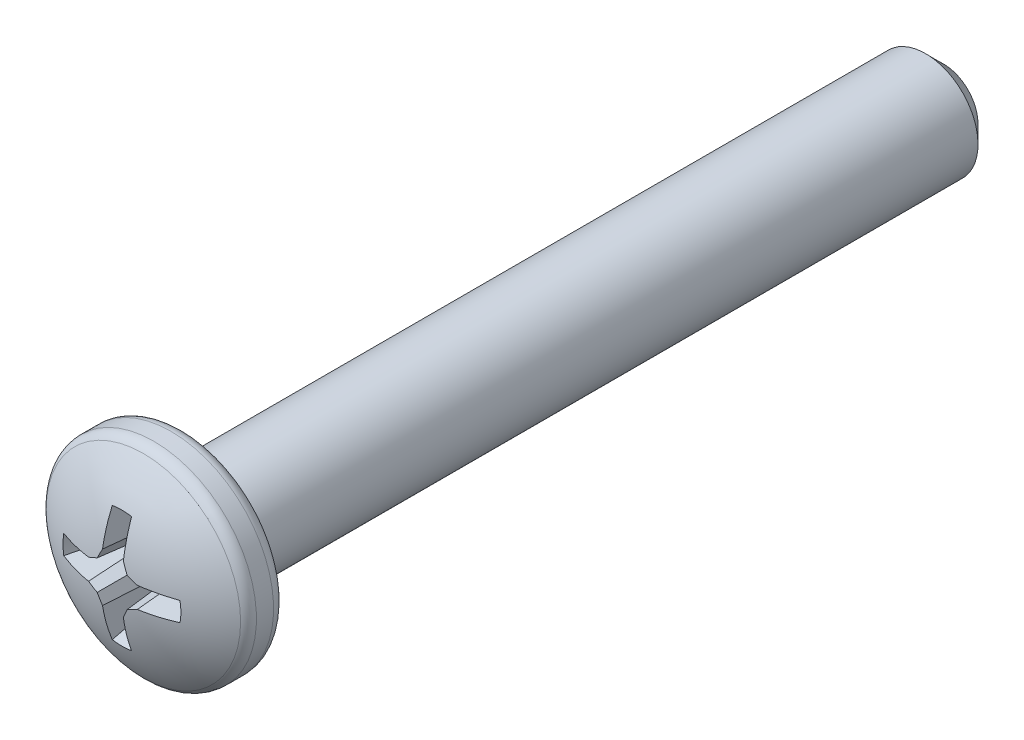
ISO-10303-21;
HEADER;
FILE_DESCRIPTION(('STEP AP214'),'2;1');
FILE_NAME('part.step','',(''),(''),'','','');
FILE_SCHEMA(('AUTOMOTIVE_DESIGN { 1 0 10303 214 1 1 1 1 }'));
ENDSEC;
DATA;
#1=APPLICATION_CONTEXT('core data for automotive mechanical design processes');
#2=APPLICATION_PROTOCOL_DEFINITION('international standard','automotive_design',2000,#1);
#3=PRODUCT_CONTEXT('',#1,'mechanical');
#4=PRODUCT('Part','Part','',(#3));
#5=PRODUCT_RELATED_PRODUCT_CATEGORY('part','',(#4));
#6=PRODUCT_DEFINITION_FORMATION('','',#4);
#7=PRODUCT_DEFINITION_CONTEXT('part definition',#1,'design');
#8=PRODUCT_DEFINITION('design','',#6,#7);
#9=PRODUCT_DEFINITION_SHAPE('','',#8);
#10=(LENGTH_UNIT() NAMED_UNIT(*) SI_UNIT(.MILLI.,.METRE.));
#11=(NAMED_UNIT(*) PLANE_ANGLE_UNIT() SI_UNIT($,.RADIAN.));
#12=(NAMED_UNIT(*) SI_UNIT($,.STERADIAN.) SOLID_ANGLE_UNIT());
#13=UNCERTAINTY_MEASURE_WITH_UNIT(LENGTH_MEASURE(1.E-05),#10,'distance_accuracy_value','');
#14=(GEOMETRIC_REPRESENTATION_CONTEXT(3) GLOBAL_UNCERTAINTY_ASSIGNED_CONTEXT((#13)) GLOBAL_UNIT_ASSIGNED_CONTEXT((#10,
#11,#12)) REPRESENTATION_CONTEXT('',''));
#15=CARTESIAN_POINT('',(0.,0.,0.));
#16=DIRECTION('',(0.,0.,1.));
#17=DIRECTION('',(1.,0.,0.));
#18=AXIS2_PLACEMENT_3D('',#15,#16,#17);
#19=CARTESIAN_POINT('',(0.,1.75259999999998,0.));
#20=DIRECTION('',(0.,0.,1.));
#21=DIRECTION('',(0.,-1.,0.));
#22=AXIS2_PLACEMENT_3D('',#19,#20,#21);
#23=PLANE('',#22);
#24=CARTESIAN_POINT('',(0.,0.,0.));
#25=DIRECTION('',(0.,0.,1.));
#26=DIRECTION('',(0.,-1.,0.));
#27=AXIS2_PLACEMENT_3D('',#24,#25,#26);
#28=CIRCLE('',#27,1.75259999999998);
#29=CARTESIAN_POINT('',(0.,-1.75259999999998,0.));
#30=VERTEX_POINT('',#29);
#31=EDGE_CURVE('E418',#30,#30,#28,.T.);
#32=ORIENTED_EDGE('',*,*,#31,.T.);
#33=EDGE_LOOP('',(#32));
#34=FACE_BOUND('',#33,.T.);
#35=CARTESIAN_POINT('',(0.,0.,0.));
#36=DIRECTION('',(0.,0.,-1.));
#37=DIRECTION('',(0.,1.,0.));
#38=AXIS2_PLACEMENT_3D('',#35,#36,#37);
#39=CIRCLE('',#38,2.985516);
#40=CARTESIAN_POINT('',(0.,2.985516,0.));
#41=VERTEX_POINT('',#40);
#42=EDGE_CURVE('E414',#41,#41,#39,.T.);
#43=ORIENTED_EDGE('',*,*,#42,.T.);
#44=EDGE_LOOP('',(#43));
#45=FACE_BOUND('',#44,.T.);
#46=ADVANCED_FACE('F39',(#34,#45),#23,.F.);
#47=CARTESIAN_POINT('',(0.,0.,-25.4));
#48=DIRECTION('',(0.,0.,1.));
#49=DIRECTION('',(0.,-1.,0.));
#50=AXIS2_PLACEMENT_3D('',#47,#48,#49);
#51=PLANE('',#50);
#52=CARTESIAN_POINT('',(0.,0.,-25.4));
#53=DIRECTION('',(0.,0.,1.));
#54=DIRECTION('',(0.,-1.,0.));
#55=AXIS2_PLACEMENT_3D('',#52,#53,#54);
#56=CIRCLE('',#55,1.15728749999998);
#57=CARTESIAN_POINT('',(0.,-1.15728749999998,-25.4));
#58=VERTEX_POINT('',#57);
#59=EDGE_CURVE('E426',#58,#58,#56,.T.);
#60=ORIENTED_EDGE('',*,*,#59,.F.);
#61=EDGE_LOOP('',(#60));
#62=FACE_BOUND('',#61,.T.);
#63=ADVANCED_FACE('F484',(#62),#51,.F.);
#64=CARTESIAN_POINT('',(0.,0.,-25.4));
#65=DIRECTION('',(0.,0.,1.));
#66=DIRECTION('',(0.,-1.,0.));
#67=AXIS2_PLACEMENT_3D('',#64,#65,#66);
#68=CONICAL_SURFACE('',#67,1.15728749999998,0.785398163397442);
#69=CARTESIAN_POINT('',(0.,0.,-24.8046875));
#70=DIRECTION('',(0.,0.,1.));
#71=DIRECTION('',(0.,-1.,0.));
#72=AXIS2_PLACEMENT_3D('',#69,#70,#71);
#73=CIRCLE('',#72,1.75259999999998);
#74=CARTESIAN_POINT('',(0.,-1.75259999999998,-24.8046875));
#75=VERTEX_POINT('',#74);
#76=EDGE_CURVE('E422',#75,#75,#73,.T.);
#77=ORIENTED_EDGE('',*,*,#76,.F.);
#78=EDGE_LOOP('',(#77));
#79=FACE_BOUND('',#78,.T.);
#80=ORIENTED_EDGE('',*,*,#59,.T.);
#81=EDGE_LOOP('',(#80));
#82=FACE_BOUND('',#81,.T.);
#83=ADVANCED_FACE('F490',(#79,#82),#68,.T.);
#84=CARTESIAN_POINT('',(0.,0.,2.4638));
#85=DIRECTION('',(0.,0.,1.));
#86=DIRECTION('',(0.,-1.,0.));
#87=AXIS2_PLACEMENT_3D('',#84,#85,#86);
#88=CYLINDRICAL_SURFACE('',#87,1.75259999999998);
#89=ORIENTED_EDGE('',*,*,#31,.F.);
#90=EDGE_LOOP('',(#89));
#91=FACE_BOUND('',#90,.T.);
#92=ORIENTED_EDGE('',*,*,#76,.T.);
#93=EDGE_LOOP('',(#92));
#94=FACE_BOUND('',#93,.T.);
#95=ADVANCED_FACE('F498',(#91,#94),#88,.T.);
#96=CARTESIAN_POINT('',(0.,0.,0.443484));
#97=DIRECTION('',(0.,0.,-1.));
#98=DIRECTION('',(0.,1.,0.));
#99=AXIS2_PLACEMENT_3D('',#96,#97,#98);
#100=TOROIDAL_SURFACE('',#99,2.985516,0.443484);
#101=ORIENTED_EDGE('',*,*,#42,.F.);
#102=EDGE_LOOP('',(#101));
#103=FACE_BOUND('',#102,.T.);
#104=CARTESIAN_POINT('',(0.,0.,0.443484));
#105=DIRECTION('',(0.,0.,-1.));
#106=DIRECTION('',(0.,1.,0.));
#107=AXIS2_PLACEMENT_3D('',#104,#105,#106);
#108=CIRCLE('',#107,3.429);
#109=CARTESIAN_POINT('',(0.,3.429,0.443484000000001));
#110=VERTEX_POINT('',#109);
#111=EDGE_CURVE('E410',#110,#110,#108,.T.);
#112=ORIENTED_EDGE('',*,*,#111,.T.);
#113=EDGE_LOOP('',(#112));
#114=FACE_BOUND('',#113,.T.);
#115=ADVANCED_FACE('F501',(#103,#114),#100,.T.);
#116=CARTESIAN_POINT('',(0.,0.,2.4638));
#117=DIRECTION('',(0.,0.,1.));
#118=DIRECTION('',(0.,-1.,0.));
#119=AXIS2_PLACEMENT_3D('',#116,#117,#118);
#120=CYLINDRICAL_SURFACE('',#119,3.429);
#121=ORIENTED_EDGE('',*,*,#111,.F.);
#122=EDGE_LOOP('',(#121));
#123=FACE_BOUND('',#122,.T.);
#124=CARTESIAN_POINT('',(0.,0.,1.01730649953871));
#125=DIRECTION('',(0.,0.,-1.));
#126=DIRECTION('',(0.,1.,0.));
#127=AXIS2_PLACEMENT_3D('',#124,#125,#126);
#128=CIRCLE('',#127,3.429);
#129=CARTESIAN_POINT('',(0.,3.429,1.01730649953871));
#130=VERTEX_POINT('',#129);
#131=EDGE_CURVE('E406',#130,#130,#128,.T.);
#132=ORIENTED_EDGE('',*,*,#131,.T.);
#133=EDGE_LOOP('',(#132));
#134=FACE_BOUND('',#133,.T.);
#135=ADVANCED_FACE('F496',(#123,#134),#120,.T.);
#136=CARTESIAN_POINT('',(0.,0.,-2.92446958762888));
#137=DIRECTION('',(0.,0.,-1.));
#138=DIRECTION('',(0.,1.,0.));
#139=AXIS2_PLACEMENT_3D('',#136,#137,#138);
#140=SPHERICAL_SURFACE('',#139,5.38826958762888);
#141=CARTESIAN_POINT('',(0.,0.,2.08992816585163));
#142=DIRECTION('',(0.,0.,-1.));
#143=DIRECTION('',(-1.,0.,0.));
#144=AXIS2_PLACEMENT_3D('',#141,#142,#143);
#145=CIRCLE('',#144,1.97212178093947);
#146=CARTESIAN_POINT('',(1.94550920693829,0.322890452900373,2.08992816585163));
#147=VERTEX_POINT('',#146);
#148=CARTESIAN_POINT('',(1.9455092069383,-0.32289045290038,2.08992816585163));
#149=VERTEX_POINT('',#148);
#150=EDGE_CURVE('E83',#147,#149,#145,.T.);
#151=ORIENTED_EDGE('',*,*,#150,.T.);
#152=CARTESIAN_POINT('',(0.,0.114932778849379,-2.91441427241202));
#153=DIRECTION('',(0.,0.996194698091746,0.0871557427476584));
#154=DIRECTION('',(0.,-0.0871557427476584,0.996194698091746));
#155=AXIS2_PLACEMENT_3D('',#152,#153,#154);
#156=CIRCLE('',#155,5.38703429504102);
#157=CARTESIAN_POINT('',(0.817336531033417,-0.349142698896174,2.38999271064856));
#158=VERTEX_POINT('',#157);
#159=EDGE_CURVE('E395',#149,#158,#156,.F.);
#160=ORIENTED_EDGE('',*,*,#159,.T.);
#161=CARTESIAN_POINT('',(0.0825801298106742,-0.177093659875576,-2.94156498043366));
#162=DIRECTION('',(-0.421010071662831,0.902859012285175,0.0871557427476584));
#163=DIRECTION('',(-0.906307787036651,-0.422618261740696,0.));
#164=AXIS2_PLACEMENT_3D('',#161,#162,#163);
#165=CIRCLE('',#164,5.38469825099824);
#166=CARTESIAN_POINT('',(0.499828677828187,-0.499828677828188,2.41723348672927));
#167=VERTEX_POINT('',#166);
#168=EDGE_CURVE('E396',#158,#167,#165,.F.);
#169=ORIENTED_EDGE('',*,*,#168,.T.);
#170=CARTESIAN_POINT('',(0.177093659875576,-0.0825801298106808,-2.94156498043366));
#171=DIRECTION('',(-0.90285901228517,0.421010071662843,0.0871557427476584));
#172=DIRECTION('',(-0.422618261740708,-0.906307787036646,0.));
#173=AXIS2_PLACEMENT_3D('',#170,#171,#172);
#174=CIRCLE('',#173,5.38469825099824);
#175=CARTESIAN_POINT('',(0.349142698896169,-0.817336531033417,2.38999271064856));
#176=VERTEX_POINT('',#175);
#177=EDGE_CURVE('E600',#167,#176,#174,.F.);
#178=ORIENTED_EDGE('',*,*,#177,.T.);
#179=CARTESIAN_POINT('',(-0.114932778849379,0.,-2.91441427241203));
#180=DIRECTION('',(-0.996194698091746,0.,0.0871557427476584));
#181=DIRECTION('',(-0.0871557427476584,0.,-0.996194698091746));
#182=AXIS2_PLACEMENT_3D('',#179,#180,#181);
#183=CIRCLE('',#182,5.38703429504102);
#184=CARTESIAN_POINT('',(0.322890452900367,-1.94550920693829,2.08992816585163));
#185=VERTEX_POINT('',#184);
#186=EDGE_CURVE('E594',#176,#185,#183,.F.);
#187=ORIENTED_EDGE('',*,*,#186,.T.);
#188=CARTESIAN_POINT('',(0.,0.,2.08992816585163));
#189=DIRECTION('',(0.,0.,-1.));
#190=DIRECTION('',(0.,1.,0.));
#191=AXIS2_PLACEMENT_3D('',#188,#189,#190);
#192=CIRCLE('',#191,1.97212178093947);
#193=CARTESIAN_POINT('',(-0.322890452900373,-1.9455092069383,2.08992816585163));
#194=VERTEX_POINT('',#193);
#195=EDGE_CURVE('E335',#185,#194,#192,.T.);
#196=ORIENTED_EDGE('',*,*,#195,.T.);
#197=CARTESIAN_POINT('',(0.114932778849379,0.,-2.91441427241202));
#198=DIRECTION('',(0.996194698091746,0.,0.0871557427476584));
#199=DIRECTION('',(-0.0871557427476584,0.,0.996194698091746));
#200=AXIS2_PLACEMENT_3D('',#197,#198,#199);
#201=CIRCLE('',#200,5.38703429504102);
#202=CARTESIAN_POINT('',(-0.349142698896172,-0.817336531033418,2.38999271064856));
#203=VERTEX_POINT('',#202);
#204=EDGE_CURVE('E329',#194,#203,#201,.F.);
#205=ORIENTED_EDGE('',*,*,#204,.T.);
#206=CARTESIAN_POINT('',(-0.177093659875576,-0.0825801298106748,-2.94156498043366));
#207=DIRECTION('',(0.902859012285174,0.421010071662834,0.0871557427476584));
#208=DIRECTION('',(-0.422618261740699,0.90630778703665,0.));
#209=AXIS2_PLACEMENT_3D('',#206,#207,#208);
#210=CIRCLE('',#209,5.38469825099824);
#211=CARTESIAN_POINT('',(-0.499828677828187,-0.499828677828189,2.41723348672927));
#212=VERTEX_POINT('',#211);
#213=EDGE_CURVE('E330',#203,#212,#210,.F.);
#214=ORIENTED_EDGE('',*,*,#213,.T.);
#215=CARTESIAN_POINT('',(-0.0825801298106802,-0.177093659875576,-2.94156498043366));
#216=DIRECTION('',(0.42101007166284,0.902859012285171,0.0871557427476584));
#217=DIRECTION('',(-0.906307787036647,0.422618261740705,0.));
#218=AXIS2_PLACEMENT_3D('',#215,#216,#217);
#219=CIRCLE('',#218,5.38469825099824);
#220=CARTESIAN_POINT('',(-0.817336531033416,-0.349142698896172,2.38999271064856));
#221=VERTEX_POINT('',#220);
#222=EDGE_CURVE('E572',#212,#221,#219,.F.);
#223=ORIENTED_EDGE('',*,*,#222,.T.);
#224=CARTESIAN_POINT('',(0.,0.114932778849379,-2.91441427241203));
#225=DIRECTION('',(0.,0.996194698091746,0.0871557427476584));
#226=DIRECTION('',(0.,0.0871557427476584,-0.996194698091746));
#227=AXIS2_PLACEMENT_3D('',#224,#225,#226);
#228=CIRCLE('',#227,5.38703429504102);
#229=CARTESIAN_POINT('',(-1.94550920693829,-0.322890452900373,2.08992816585163));
#230=VERTEX_POINT('',#229);
#231=EDGE_CURVE('E565',#221,#230,#228,.F.);
#232=ORIENTED_EDGE('',*,*,#231,.T.);
#233=CARTESIAN_POINT('',(0.,0.,2.08992816585163));
#234=DIRECTION('',(0.,0.,-1.));
#235=DIRECTION('',(1.,0.,0.));
#236=AXIS2_PLACEMENT_3D('',#233,#234,#235);
#237=CIRCLE('',#236,1.97212178093947);
#238=CARTESIAN_POINT('',(-1.9455092069383,0.322890452900394,2.08992816585163));
#239=VERTEX_POINT('',#238);
#240=EDGE_CURVE('E267',#230,#239,#237,.T.);
#241=ORIENTED_EDGE('',*,*,#240,.T.);
#242=CARTESIAN_POINT('',(0.,-0.114932778849379,-2.91441427241202));
#243=DIRECTION('',(0.,-0.996194698091746,0.0871557427476584));
#244=DIRECTION('',(0.,0.0871557427476584,0.996194698091746));
#245=AXIS2_PLACEMENT_3D('',#242,#243,#244);
#246=CIRCLE('',#245,5.38703429504102);
#247=CARTESIAN_POINT('',(-0.817336531033415,0.34914269889618,2.38999271064856));
#248=VERTEX_POINT('',#247);
#249=EDGE_CURVE('E261',#239,#248,#246,.F.);
#250=ORIENTED_EDGE('',*,*,#249,.T.);
#251=CARTESIAN_POINT('',(-0.0825801298106729,0.177093659875577,-2.94156498043366));
#252=DIRECTION('',(0.421010071662825,-0.902859012285178,0.0871557427476584));
#253=DIRECTION('',(0.906307787036654,0.42261826174069,0.));
#254=AXIS2_PLACEMENT_3D('',#251,#252,#253);
#255=CIRCLE('',#254,5.38469825099824);
#256=CARTESIAN_POINT('',(-0.499828677828183,0.499828677828192,2.41723348672927));
#257=VERTEX_POINT('',#256);
#258=EDGE_CURVE('E262',#248,#257,#255,.F.);
#259=ORIENTED_EDGE('',*,*,#258,.T.);
#260=CARTESIAN_POINT('',(-0.177093659875575,0.0825801298106821,-2.94156498043366));
#261=DIRECTION('',(0.902859012285167,-0.421010071662849,0.0871557427476584));
#262=DIRECTION('',(0.422618261740714,0.906307787036643,0.));
#263=AXIS2_PLACEMENT_3D('',#260,#261,#262);
#264=CIRCLE('',#263,5.38469825099824);
#265=CARTESIAN_POINT('',(-0.349142698896163,0.817336531033419,2.38999271064856));
#266=VERTEX_POINT('',#265);
#267=EDGE_CURVE('E538',#257,#266,#264,.F.);
#268=ORIENTED_EDGE('',*,*,#267,.T.);
#269=CARTESIAN_POINT('',(0.114932778849379,0.,-2.91441427241203));
#270=DIRECTION('',(0.996194698091746,0.,0.0871557427476584));
#271=DIRECTION('',(0.0871557427476584,0.,-0.996194698091746));
#272=AXIS2_PLACEMENT_3D('',#269,#270,#271);
#273=CIRCLE('',#272,5.38703429504102);
#274=CARTESIAN_POINT('',(-0.322890452900353,1.9455092069383,2.08992816585163));
#275=VERTEX_POINT('',#274);
#276=EDGE_CURVE('E219',#266,#275,#273,.F.);
#277=ORIENTED_EDGE('',*,*,#276,.T.);
#278=CARTESIAN_POINT('',(0.,0.,2.08992816585163));
#279=DIRECTION('',(0.,0.,-1.));
#280=DIRECTION('',(-1.,0.,0.));
#281=AXIS2_PLACEMENT_3D('',#278,#279,#280);
#282=CIRCLE('',#281,1.97212178093948);
#283=CARTESIAN_POINT('',(0.322890452900373,1.9455092069383,2.08992816585163));
#284=VERTEX_POINT('',#283);
#285=EDGE_CURVE('E11',#275,#284,#282,.T.);
#286=ORIENTED_EDGE('',*,*,#285,.T.);
#287=CARTESIAN_POINT('',(-0.114932778849379,0.,-2.91441427241202));
#288=DIRECTION('',(-0.996194698091746,0.,0.0871557427476584));
#289=DIRECTION('',(0.0871557427476584,0.,0.996194698091746));
#290=AXIS2_PLACEMENT_3D('',#287,#288,#289);
#291=CIRCLE('',#290,5.38703429504102);
#292=CARTESIAN_POINT('',(0.349142698896172,0.817336531033418,2.38999271064856));
#293=VERTEX_POINT('',#292);
#294=EDGE_CURVE('E56',#284,#293,#291,.F.);
#295=ORIENTED_EDGE('',*,*,#294,.T.);
#296=CARTESIAN_POINT('',(0.177093659875576,0.0825801298106748,-2.94156498043366));
#297=DIRECTION('',(-0.902859012285174,-0.421010071662834,0.0871557427476584));
#298=DIRECTION('',(0.422618261740699,-0.90630778703665,0.));
#299=AXIS2_PLACEMENT_3D('',#296,#297,#298);
#300=CIRCLE('',#299,5.38469825099824);
#301=CARTESIAN_POINT('',(0.499828677828187,0.499828677828189,2.41723348672927));
#302=VERTEX_POINT('',#301);
#303=EDGE_CURVE('E531',#293,#302,#300,.F.);
#304=ORIENTED_EDGE('',*,*,#303,.T.);
#305=CARTESIAN_POINT('',(0.0825801298106802,0.177093659875576,-2.94156498043366));
#306=DIRECTION('',(-0.42101007166284,-0.902859012285171,0.0871557427476584));
#307=DIRECTION('',(0.906307787036647,-0.422618261740705,0.));
#308=AXIS2_PLACEMENT_3D('',#305,#306,#307);
#309=CIRCLE('',#308,5.38469825099824);
#310=CARTESIAN_POINT('',(0.817336531033416,0.349142698896172,2.38999271064856));
#311=VERTEX_POINT('',#310);
#312=EDGE_CURVE('E528',#302,#311,#309,.F.);
#313=ORIENTED_EDGE('',*,*,#312,.T.);
#314=CARTESIAN_POINT('',(0.,-0.114932778849379,-2.91441427241203));
#315=DIRECTION('',(0.,-0.996194698091746,0.0871557427476584));
#316=DIRECTION('',(0.,-0.0871557427476584,-0.996194698091746));
#317=AXIS2_PLACEMENT_3D('',#314,#315,#316);
#318=CIRCLE('',#317,5.38703429504102);
#319=EDGE_CURVE('E432',#311,#147,#318,.F.);
#320=ORIENTED_EDGE('',*,*,#319,.T.);
#321=EDGE_LOOP('',(#151,#160,#169,#178,#187,#196,#205,#214,#223,#232,#241,#250,#259,#268,#277,
#286,#295,#304,#313,#320));
#322=FACE_BOUND('',#321,.T.);
#323=CARTESIAN_POINT('',(0.,0.,1.37083338058588));
#324=DIRECTION('',(0.,0.,-1.));
#325=DIRECTION('',(0.,1.,0.));
#326=AXIS2_PLACEMENT_3D('',#323,#324,#325);
#327=CIRCLE('',#326,3.25327858632053);
#328=CARTESIAN_POINT('',(0.,3.25327858632053,1.37083338058588));
#329=VERTEX_POINT('',#328);
#330=EDGE_CURVE('E402',#329,#329,#327,.T.);
#331=ORIENTED_EDGE('',*,*,#330,.F.);
#332=EDGE_LOOP('',(#331));
#333=FACE_BOUND('',#332,.T.);
#334=ADVANCED_FACE('F523',(#322,#333),#140,.T.);
#335=CARTESIAN_POINT('',(0.,0.,1.01730649953871));
#336=DIRECTION('',(0.,0.,-1.));
#337=DIRECTION('',(0.,1.,0.));
#338=AXIS2_PLACEMENT_3D('',#335,#336,#337);
#339=TOROIDAL_SURFACE('',#338,2.985516,0.443484);
#340=ORIENTED_EDGE('',*,*,#131,.F.);
#341=EDGE_LOOP('',(#340));
#342=FACE_BOUND('',#341,.T.);
#343=ORIENTED_EDGE('',*,*,#330,.T.);
#344=EDGE_LOOP('',(#343));
#345=FACE_BOUND('',#344,.T.);
#346=ADVANCED_FACE('F704',(#342,#345),#339,.T.);
#347=CARTESIAN_POINT('',(0.,0.,2.4638));
#348=DIRECTION('',(0.,0.,1.));
#349=DIRECTION('',(1.,0.,0.));
#350=AXIS2_PLACEMENT_3D('',#347,#348,#349);
#351=CONICAL_SURFACE('',#350,2.1082,0.349065850398867);
#352=ORIENTED_EDGE('',*,*,#285,.F.);
#353=CARTESIAN_POINT('',(-0.17237861618409,1.33487863760715,0.36957));
#354=CARTESIAN_POINT('',(-0.197459123911537,1.43680611439167,0.656241515104548));
#355=CARTESIAN_POINT('',(-0.222542031008205,1.53865573426321,0.942940455124769));
#356=CARTESIAN_POINT('',(-0.272712643247092,1.7421992573693,1.51639317707683));
#357=CARTESIAN_POINT('',(-0.297800348389179,1.84389316060814,1.80314695900715));
#358=CARTESIAN_POINT('',(-0.322890452900353,1.94550920693831,2.08992816585163));
#359=B_SPLINE_CURVE_WITH_KNOTS('',3,(#353,#354,#355,#356,#357,#358),.UNSPECIFIED.,.F.,.F.,(4,2,
4),(0.,0.915854254532922,1.83170848376883),.UNSPECIFIED.);
#360=CARTESIAN_POINT('',(-0.17237861618409,1.33487863760715,0.36957));
#361=VERTEX_POINT('',#360);
#362=EDGE_CURVE('E207',#361,#275,#359,.T.);
#363=ORIENTED_EDGE('',*,*,#362,.F.);
#364=CARTESIAN_POINT('',(0.,0.,0.36957));
#365=DIRECTION('',(0.,0.,-1.));
#366=DIRECTION('',(-1.,0.,0.));
#367=AXIS2_PLACEMENT_3D('',#364,#365,#366);
#368=CIRCLE('',#367,1.34596261629269);
#369=CARTESIAN_POINT('',(0.172378616184104,1.33487863760715,0.36957));
#370=VERTEX_POINT('',#369);
#371=EDGE_CURVE('E190',#370,#361,#368,.F.);
#372=ORIENTED_EDGE('',*,*,#371,.F.);
#373=CARTESIAN_POINT('',(0.41172087008059,2.30519477278666,3.10526448029761));
#374=CARTESIAN_POINT('',(0.391772072621791,2.22445234434868,2.87724868196635));
#375=CARTESIAN_POINT('',(0.371823739482919,2.14369480702574,2.64923819083613));
#376=CARTESIAN_POINT('',(0.331928566812395,1.98213125991069,2.19323428058435));
#377=CARTESIAN_POINT('',(0.311981727280581,1.90132525012383,1.96524086146093));
#378=CARTESIAN_POINT('',(0.272090100896322,1.73964647952124,1.50927748544664));
#379=CARTESIAN_POINT('',(0.252145314044037,1.65877371870025,1.2813075285576));
#380=CARTESIAN_POINT('',(0.212259108946292,1.49691884225458,0.825406118131701));
#381=CARTESIAN_POINT('',(0.19231769070121,1.41593672661758,0.59747466459918));
#382=CARTESIAN_POINT('',(0.172378616184104,1.33487863760715,0.369569999999999));
#383=B_SPLINE_CURVE_WITH_KNOTS('',3,(#373,#374,#375,#376,#377,#378,#379,#380,#381,#382),
.UNSPECIFIED.,.F.,.F.,(4,2,2,2,4),(0.,0.72813219260434,1.45626430626049,2.18439647719575,
2.91252873009422),.UNSPECIFIED.);
#384=EDGE_CURVE('E87',#370,#284,#383,.F.);
#385=ORIENTED_EDGE('',*,*,#384,.T.);
#386=EDGE_LOOP('',(#352,#363,#372,#385));
#387=FACE_BOUND('',#386,.T.);
#388=ADVANCED_FACE('F213',(#387),#351,.F.);
#389=CARTESIAN_POINT('',(0.3556,0.,2.4638));
#390=DIRECTION('',(-0.996194698091746,0.,0.0871557427476584));
#391=DIRECTION('',(0.0871557427476584,0.,0.996194698091746));
#392=AXIS2_PLACEMENT_3D('',#389,#390,#391);
#393=PLANE('',#392);
#394=ORIENTED_EDGE('',*,*,#384,.F.);
#395=DIRECTION('',(0.,-1.,0.));
#396=VECTOR('',#395,1.);
#397=CARTESIAN_POINT('',(0.172378616184104,0.,0.36957));
#398=LINE('',#397,#396);
#399=CARTESIAN_POINT('',(0.172378616184104,0.778148877349178,0.36957));
#400=VERTEX_POINT('',#399);
#401=EDGE_CURVE('E197',#400,#370,#398,.F.);
#402=ORIENTED_EDGE('',*,*,#401,.F.);
#403=DIRECTION('',(0.0871394780153063,0.0193183571814852,0.996008791350271));
#404=VECTOR('',#403,1.);
#405=CARTESIAN_POINT('',(0.354221692723412,0.818462516856514,2.44804587573932));
#406=LINE('',#405,#404);
#407=EDGE_CURVE('E93',#400,#293,#406,.T.);
#408=ORIENTED_EDGE('',*,*,#407,.T.);
#409=ORIENTED_EDGE('',*,*,#294,.F.);
#410=EDGE_LOOP('',(#394,#402,#408,#409));
#411=FACE_BOUND('',#410,.T.);
#412=ADVANCED_FACE('F469',(#411),#393,.T.);
#413=CARTESIAN_POINT('',(0.605694006031361,0.282439753511003,2.4638));
#414=DIRECTION('',(-0.902859012285174,-0.421010071662834,0.0871557427476584));
#415=DIRECTION('',(0.422618261740699,-0.90630778703665,0.));
#416=AXIS2_PLACEMENT_3D('',#413,#414,#415);
#417=PLANE('',#416);
#418=ORIENTED_EDGE('',*,*,#407,.F.);
#419=DIRECTION('',(0.422618261740699,-0.90630778703665,0.));
#420=VECTOR('',#419,1.);
#421=CARTESIAN_POINT('',(0.439639039127383,0.205007050769004,0.36957));
#422=LINE('',#421,#420);
#423=CARTESIAN_POINT('',(0.365022574832765,0.365022574832767,0.36957));
#424=VERTEX_POINT('',#423);
#425=EDGE_CURVE('E454',#424,#400,#422,.F.);
#426=ORIENTED_EDGE('',*,*,#425,.F.);
#427=DIRECTION('',(0.065550618004395,0.0655506180043947,0.995693844993773));
#428=VECTOR('',#427,1.);
#429=CARTESIAN_POINT('',(0.502388793267131,0.502388793267134,2.45612085747626));
#430=LINE('',#429,#428);
#431=EDGE_CURVE('E441',#424,#302,#430,.T.);
#432=ORIENTED_EDGE('',*,*,#431,.T.);
#433=ORIENTED_EDGE('',*,*,#303,.F.);
#434=EDGE_LOOP('',(#418,#426,#432,#433));
#435=FACE_BOUND('',#434,.T.);
#436=ADVANCED_FACE('F41',(#435),#417,.T.);
#437=CARTESIAN_POINT('',(0.282439753511008,0.605694006031361,2.4638));
#438=DIRECTION('',(-0.42101007166284,-0.902859012285171,0.0871557427476584));
#439=DIRECTION('',(0.906307787036647,-0.422618261740705,0.));
#440=AXIS2_PLACEMENT_3D('',#437,#438,#439);
#441=PLANE('',#440);
#442=ORIENTED_EDGE('',*,*,#431,.F.);
#443=DIRECTION('',(0.906307787036647,-0.422618261740705,0.));
#444=VECTOR('',#443,1.);
#445=CARTESIAN_POINT('',(0.205007050769007,0.439639039127384,0.36957));
#446=LINE('',#445,#444);
#447=CARTESIAN_POINT('',(0.778148877349174,0.172378616184104,0.36957));
#448=VERTEX_POINT('',#447);
#449=EDGE_CURVE('E450',#448,#424,#446,.F.);
#450=ORIENTED_EDGE('',*,*,#449,.F.);
#451=DIRECTION('',(0.0193183571814855,0.0871394780153063,0.996008791350271));
#452=VECTOR('',#451,1.);
#453=CARTESIAN_POINT('',(0.818988929207857,0.356596185393061,2.47518645114593));
#454=LINE('',#453,#452);
#455=EDGE_CURVE('E437',#448,#311,#454,.T.);
#456=ORIENTED_EDGE('',*,*,#455,.T.);
#457=ORIENTED_EDGE('',*,*,#312,.F.);
#458=EDGE_LOOP('',(#442,#450,#456,#457));
#459=FACE_BOUND('',#458,.T.);
#460=ADVANCED_FACE('F476',(#459),#441,.T.);
#461=CARTESIAN_POINT('',(0.,0.3556,2.4638));
#462=DIRECTION('',(0.,-0.996194698091746,0.0871557427476584));
#463=DIRECTION('',(0.,-0.0871557427476584,-0.996194698091746));
#464=AXIS2_PLACEMENT_3D('',#461,#462,#463);
#465=PLANE('',#464);
#466=ORIENTED_EDGE('',*,*,#455,.F.);
#467=DIRECTION('',(1.,0.,0.));
#468=VECTOR('',#467,1.);
#469=CARTESIAN_POINT('',(0.,0.172378616184104,0.36957));
#470=LINE('',#469,#468);
#471=CARTESIAN_POINT('',(1.33487863760715,0.172378616184104,0.36957));
#472=VERTEX_POINT('',#471);
#473=EDGE_CURVE('E435',#472,#448,#470,.F.);
#474=ORIENTED_EDGE('',*,*,#473,.F.);
#475=CARTESIAN_POINT('',(1.33487863760715,0.172378616184104,0.36957));
#476=CARTESIAN_POINT('',(1.43680611439167,0.197459123911553,0.656241515104548));
#477=CARTESIAN_POINT('',(1.53865573426321,0.222542031008221,0.94294045512477));
#478=CARTESIAN_POINT('',(1.7421992573693,0.27271264324711,1.51639317707683));
#479=CARTESIAN_POINT('',(1.84389316060814,0.297800348389198,1.80314695900715));
#480=CARTESIAN_POINT('',(1.9455092069383,0.322890452900373,2.08992816585163));
#481=B_SPLINE_CURVE_WITH_KNOTS('',3,(#475,#476,#477,#478,#479,#480),.UNSPECIFIED.,.F.,.F.,(4,2,
4),(0.,0.915854254532921,1.83170848376883),.UNSPECIFIED.);
#482=EDGE_CURVE('E43',#472,#147,#481,.T.);
#483=ORIENTED_EDGE('',*,*,#482,.T.);
#484=ORIENTED_EDGE('',*,*,#319,.F.);
#485=EDGE_LOOP('',(#466,#474,#483,#484));
#486=FACE_BOUND('',#485,.T.);
#487=ADVANCED_FACE('F472',(#486),#465,.T.);
#488=CARTESIAN_POINT('',(0.,0.,2.4638));
#489=DIRECTION('',(0.,0.,1.));
#490=DIRECTION('',(1.,0.,0.));
#491=AXIS2_PLACEMENT_3D('',#488,#489,#490);
#492=CONICAL_SURFACE('',#491,2.10819999999999,0.349065850398867);
#493=ORIENTED_EDGE('',*,*,#482,.F.);
#494=CARTESIAN_POINT('',(0.,0.,0.36957));
#495=DIRECTION('',(0.,0.,-1.));
#496=DIRECTION('',(-1.,0.,0.));
#497=AXIS2_PLACEMENT_3D('',#494,#495,#496);
#498=CIRCLE('',#497,1.34596261629268);
#499=CARTESIAN_POINT('',(1.33487863760715,-0.172378616184109,0.36957));
#500=VERTEX_POINT('',#499);
#501=EDGE_CURVE('E401',#500,#472,#498,.F.);
#502=ORIENTED_EDGE('',*,*,#501,.F.);
#503=CARTESIAN_POINT('',(2.30519477278666,-0.411720870080598,3.10526448029761));
#504=CARTESIAN_POINT('',(2.22445234434868,-0.391772072621799,2.87724868196635));
#505=CARTESIAN_POINT('',(2.14369480702574,-0.371823739482926,2.64923819083613));
#506=CARTESIAN_POINT('',(1.98213125991068,-0.331928566812402,2.19323428058435));
#507=CARTESIAN_POINT('',(1.90132525012383,-0.311981727280588,1.96524086146093));
#508=CARTESIAN_POINT('',(1.73964647952123,-0.272090100896328,1.50927748544664));
#509=CARTESIAN_POINT('',(1.65877371870025,-0.252145314044043,1.2813075285576));
#510=CARTESIAN_POINT('',(1.49691884225457,-0.212259108946297,0.825406118131701));
#511=CARTESIAN_POINT('',(1.41593672661758,-0.192317690701215,0.59747466459918));
#512=CARTESIAN_POINT('',(1.33487863760715,-0.172378616184109,0.369569999999999));
#513=B_SPLINE_CURVE_WITH_KNOTS('',3,(#503,#504,#505,#506,#507,#508,#509,#510,#511,#512),
.UNSPECIFIED.,.F.,.F.,(4,2,2,2,4),(0.,0.72813219260434,1.45626430626049,2.18439647719575,
2.91252873009422),.UNSPECIFIED.);
#514=EDGE_CURVE('E387',#500,#149,#513,.F.);
#515=ORIENTED_EDGE('',*,*,#514,.T.);
#516=ORIENTED_EDGE('',*,*,#150,.F.);
#517=EDGE_LOOP('',(#493,#502,#515,#516));
#518=FACE_BOUND('',#517,.T.);
#519=ADVANCED_FACE('F475',(#518),#492,.F.);
#520=CARTESIAN_POINT('',(0.,0.,0.36957));
#521=DIRECTION('',(0.,0.,-1.));
#522=DIRECTION('',(-1.,0.,0.));
#523=AXIS2_PLACEMENT_3D('',#520,#521,#522);
#524=PLANE('',#523);
#525=DIRECTION('',(-1.,0.,0.));
#526=VECTOR('',#525,1.);
#527=CARTESIAN_POINT('',(0.,-0.172378616184104,0.36957));
#528=LINE('',#527,#526);
#529=CARTESIAN_POINT('',(0.778148877349177,-0.172378616184106,0.36957));
#530=VERTEX_POINT('',#529);
#531=EDGE_CURVE('E351',#530,#500,#528,.F.);
#532=ORIENTED_EDGE('',*,*,#531,.T.);
#533=ORIENTED_EDGE('',*,*,#501,.T.);
#534=ORIENTED_EDGE('',*,*,#473,.T.);
#535=ORIENTED_EDGE('',*,*,#449,.T.);
#536=ORIENTED_EDGE('',*,*,#425,.T.);
#537=ORIENTED_EDGE('',*,*,#401,.T.);
#538=ORIENTED_EDGE('',*,*,#371,.T.);
#539=DIRECTION('',(0.,1.,0.));
#540=VECTOR('',#539,1.);
#541=CARTESIAN_POINT('',(-0.172378616184104,0.,0.36957));
#542=LINE('',#541,#540);
#543=CARTESIAN_POINT('',(-0.172378616184096,0.778148877349176,0.36957));
#544=VERTEX_POINT('',#543);
#545=EDGE_CURVE('E194',#361,#544,#542,.F.);
#546=ORIENTED_EDGE('',*,*,#545,.T.);
#547=DIRECTION('',(0.422618261740714,0.906307787036643,0.));
#548=VECTOR('',#547,1.);
#549=CARTESIAN_POINT('',(-0.439639039127382,0.205007050769012,0.36957));
#550=LINE('',#549,#548);
#551=CARTESIAN_POINT('',(-0.365022574832764,0.365022574832768,0.36957));
#552=VERTEX_POINT('',#551);
#553=EDGE_CURVE('E211',#544,#552,#550,.F.);
#554=ORIENTED_EDGE('',*,*,#553,.T.);
#555=DIRECTION('',(0.906307787036654,0.42261826174069,0.));
#556=VECTOR('',#555,1.);
#557=CARTESIAN_POINT('',(-0.205007050768999,0.439639039127385,0.36957));
#558=LINE('',#557,#556);
#559=CARTESIAN_POINT('',(-0.778148877349176,0.172378616184112,0.36957));
#560=VERTEX_POINT('',#559);
#561=EDGE_CURVE('E222',#552,#560,#558,.F.);
#562=ORIENTED_EDGE('',*,*,#561,.T.);
#563=DIRECTION('',(1.,0.,0.));
#564=VECTOR('',#563,1.);
#565=CARTESIAN_POINT('',(0.,0.172378616184104,0.36957));
#566=LINE('',#565,#564);
#567=CARTESIAN_POINT('',(-1.33487863760715,0.172378616184118,0.36957));
#568=VERTEX_POINT('',#567);
#569=EDGE_CURVE('E215',#560,#568,#566,.F.);
#570=ORIENTED_EDGE('',*,*,#569,.T.);
#571=CARTESIAN_POINT('',(0.,0.,0.36957));
#572=DIRECTION('',(0.,0.,-1.));
#573=DIRECTION('',(1.,0.,0.));
#574=AXIS2_PLACEMENT_3D('',#571,#572,#573);
#575=CIRCLE('',#574,1.34596261629268);
#576=CARTESIAN_POINT('',(-1.33487863760715,-0.172378616184104,0.36957));
#577=VERTEX_POINT('',#576);
#578=EDGE_CURVE('E271',#568,#577,#575,.F.);
#579=ORIENTED_EDGE('',*,*,#578,.T.);
#580=DIRECTION('',(-1.,0.,0.));
#581=VECTOR('',#580,1.);
#582=CARTESIAN_POINT('',(0.,-0.172378616184104,0.36957));
#583=LINE('',#582,#581);
#584=CARTESIAN_POINT('',(-0.778148877349174,-0.172378616184104,0.36957));
#585=VERTEX_POINT('',#584);
#586=EDGE_CURVE('E274',#577,#585,#583,.F.);
#587=ORIENTED_EDGE('',*,*,#586,.T.);
#588=DIRECTION('',(-0.906307787036647,0.422618261740705,0.));
#589=VECTOR('',#588,1.);
#590=CARTESIAN_POINT('',(-0.205007050769007,-0.439639039127384,0.36957));
#591=LINE('',#590,#589);
#592=CARTESIAN_POINT('',(-0.365022574832765,-0.365022574832767,0.36957));
#593=VERTEX_POINT('',#592);
#594=EDGE_CURVE('E277',#585,#593,#591,.F.);
#595=ORIENTED_EDGE('',*,*,#594,.T.);
#596=DIRECTION('',(-0.422618261740699,0.90630778703665,0.));
#597=VECTOR('',#596,1.);
#598=CARTESIAN_POINT('',(-0.439639039127383,-0.205007050769004,0.36957));
#599=LINE('',#598,#597);
#600=CARTESIAN_POINT('',(-0.172378616184104,-0.778148877349178,0.36957));
#601=VERTEX_POINT('',#600);
#602=EDGE_CURVE('E280',#593,#601,#599,.F.);
#603=ORIENTED_EDGE('',*,*,#602,.T.);
#604=DIRECTION('',(0.,1.,0.));
#605=VECTOR('',#604,1.);
#606=CARTESIAN_POINT('',(-0.172378616184104,0.,0.36957));
#607=LINE('',#606,#605);
#608=CARTESIAN_POINT('',(-0.172378616184104,-1.33487863760715,0.36957));
#609=VERTEX_POINT('',#608);
#610=EDGE_CURVE('E283',#601,#609,#607,.F.);
#611=ORIENTED_EDGE('',*,*,#610,.T.);
#612=CARTESIAN_POINT('',(0.,0.,0.36957));
#613=DIRECTION('',(0.,0.,-1.));
#614=DIRECTION('',(0.,1.,0.));
#615=AXIS2_PLACEMENT_3D('',#612,#613,#614);
#616=CIRCLE('',#615,1.34596261629268);
#617=CARTESIAN_POINT('',(0.172378616184099,-1.33487863760715,0.36957));
#618=VERTEX_POINT('',#617);
#619=EDGE_CURVE('E339',#609,#618,#616,.F.);
#620=ORIENTED_EDGE('',*,*,#619,.T.);
#621=DIRECTION('',(0.,-1.,0.));
#622=VECTOR('',#621,1.);
#623=CARTESIAN_POINT('',(0.172378616184104,0.,0.36957));
#624=LINE('',#623,#622);
#625=CARTESIAN_POINT('',(0.172378616184101,-0.778148877349175,0.36957));
#626=VERTEX_POINT('',#625);
#627=EDGE_CURVE('E342',#618,#626,#624,.F.);
#628=ORIENTED_EDGE('',*,*,#627,.T.);
#629=DIRECTION('',(-0.422618261740708,-0.906307787036646,0.));
#630=VECTOR('',#629,1.);
#631=CARTESIAN_POINT('',(0.439639039127383,-0.205007050769009,0.36957));
#632=LINE('',#631,#630);
#633=CARTESIAN_POINT('',(0.365022574832766,-0.365022574832766,0.36957));
#634=VERTEX_POINT('',#633);
#635=EDGE_CURVE('E345',#626,#634,#632,.F.);
#636=ORIENTED_EDGE('',*,*,#635,.T.);
#637=DIRECTION('',(-0.906307787036651,-0.422618261740696,0.));
#638=VECTOR('',#637,1.);
#639=CARTESIAN_POINT('',(0.205007050769002,-0.439639039127384,0.36957));
#640=LINE('',#639,#638);
#641=EDGE_CURVE('E348',#634,#530,#640,.F.);
#642=ORIENTED_EDGE('',*,*,#641,.T.);
#643=EDGE_LOOP('',(#532,#533,#534,#535,#536,#537,#538,#546,#554,#562,#570,#579,#587,#595,#603,
#611,#620,#628,#636,#642));
#644=FACE_BOUND('',#643,.T.);
#645=ADVANCED_FACE('F193',(#644),#524,.F.);
#646=CARTESIAN_POINT('',(0.,-0.3556,2.4638));
#647=DIRECTION('',(0.,0.996194698091746,0.0871557427476584));
#648=DIRECTION('',(0.,-0.0871557427476584,0.996194698091746));
#649=AXIS2_PLACEMENT_3D('',#646,#647,#648);
#650=PLANE('',#649);
#651=ORIENTED_EDGE('',*,*,#514,.F.);
#652=ORIENTED_EDGE('',*,*,#531,.F.);
#653=DIRECTION('',(0.0193183571814848,-0.0871394780153064,0.996008791350271));
#654=VECTOR('',#653,1.);
#655=CARTESIAN_POINT('',(0.818462516856513,-0.354221692723414,2.44804587573932));
#656=LINE('',#655,#654);
#657=EDGE_CURVE('E519',#530,#158,#656,.T.);
#658=ORIENTED_EDGE('',*,*,#657,.T.);
#659=ORIENTED_EDGE('',*,*,#159,.F.);
#660=EDGE_LOOP('',(#651,#652,#658,#659));
#661=FACE_BOUND('',#660,.T.);
#662=ADVANCED_FACE('F378',(#661),#650,.T.);
#663=CARTESIAN_POINT('',(0.282439753511001,-0.605694006031362,2.4638));
#664=DIRECTION('',(-0.421010071662831,0.902859012285175,0.0871557427476584));
#665=DIRECTION('',(-0.906307787036651,-0.422618261740696,0.));
#666=AXIS2_PLACEMENT_3D('',#663,#664,#665);
#667=PLANE('',#666);
#668=ORIENTED_EDGE('',*,*,#657,.F.);
#669=ORIENTED_EDGE('',*,*,#641,.F.);
#670=DIRECTION('',(0.0655506180043945,-0.0655506180043953,0.995693844993773));
#671=VECTOR('',#670,1.);
#672=CARTESIAN_POINT('',(0.502388793267132,-0.502388793267133,2.45612085747626));
#673=LINE('',#672,#671);
#674=EDGE_CURVE('E598',#634,#167,#673,.T.);
#675=ORIENTED_EDGE('',*,*,#674,.T.);
#676=ORIENTED_EDGE('',*,*,#168,.F.);
#677=EDGE_LOOP('',(#668,#669,#675,#676));
#678=FACE_BOUND('',#677,.T.);
#679=ADVANCED_FACE('F374',(#678),#667,.T.);
#680=CARTESIAN_POINT('',(0.60569400603136,-0.28243975351101,2.4638));
#681=DIRECTION('',(-0.90285901228517,0.421010071662843,0.0871557427476584));
#682=DIRECTION('',(-0.422618261740708,-0.906307787036646,0.));
#683=AXIS2_PLACEMENT_3D('',#680,#681,#682);
#684=PLANE('',#683);
#685=ORIENTED_EDGE('',*,*,#674,.F.);
#686=ORIENTED_EDGE('',*,*,#635,.F.);
#687=DIRECTION('',(0.0871394780153062,-0.0193183571814858,0.996008791350271));
#688=VECTOR('',#687,1.);
#689=CARTESIAN_POINT('',(0.356596185393058,-0.818988929207858,2.47518645114593));
#690=LINE('',#689,#688);
#691=EDGE_CURVE('E363',#626,#176,#690,.T.);
#692=ORIENTED_EDGE('',*,*,#691,.T.);
#693=ORIENTED_EDGE('',*,*,#177,.F.);
#694=EDGE_LOOP('',(#685,#686,#692,#693));
#695=FACE_BOUND('',#694,.T.);
#696=ADVANCED_FACE('F370',(#695),#684,.T.);
#697=CARTESIAN_POINT('',(0.3556,0.,2.4638));
#698=DIRECTION('',(-0.996194698091746,0.,0.0871557427476584));
#699=DIRECTION('',(-0.0871557427476584,0.,-0.996194698091746));
#700=AXIS2_PLACEMENT_3D('',#697,#698,#699);
#701=PLANE('',#700);
#702=ORIENTED_EDGE('',*,*,#691,.F.);
#703=ORIENTED_EDGE('',*,*,#627,.F.);
#704=CARTESIAN_POINT('',(0.172378616184099,-1.33487863760715,0.36957));
#705=CARTESIAN_POINT('',(0.197459123911548,-1.43680611439167,0.656241515104548));
#706=CARTESIAN_POINT('',(0.222542031008215,-1.53865573426321,0.94294045512477));
#707=CARTESIAN_POINT('',(0.272712643247104,-1.7421992573693,1.51639317707683));
#708=CARTESIAN_POINT('',(0.297800348389192,-1.84389316060814,1.80314695900715));
#709=CARTESIAN_POINT('',(0.322890452900366,-1.94550920693831,2.08992816585163));
#710=B_SPLINE_CURVE_WITH_KNOTS('',3,(#704,#705,#706,#707,#708,#709),.UNSPECIFIED.,.F.,.F.,(4,2,
4),(0.,0.915854254532921,1.83170848376883),.UNSPECIFIED.);
#711=EDGE_CURVE('E354',#618,#185,#710,.T.);
#712=ORIENTED_EDGE('',*,*,#711,.T.);
#713=ORIENTED_EDGE('',*,*,#186,.F.);
#714=EDGE_LOOP('',(#702,#703,#712,#713));
#715=FACE_BOUND('',#714,.T.);
#716=ADVANCED_FACE('F366',(#715),#701,.T.);
#717=CARTESIAN_POINT('',(0.,0.,2.4638));
#718=DIRECTION('',(0.,0.,1.));
#719=DIRECTION('',(0.,-1.,0.));
#720=AXIS2_PLACEMENT_3D('',#717,#718,#719);
#721=CONICAL_SURFACE('',#720,2.10819999999999,0.349065850398867);
#722=ORIENTED_EDGE('',*,*,#711,.F.);
#723=ORIENTED_EDGE('',*,*,#619,.F.);
#724=CARTESIAN_POINT('',(-0.41172087008059,-2.30519477278666,3.10526448029761));
#725=CARTESIAN_POINT('',(-0.391772072621791,-2.22445234434868,2.87724868196635));
#726=CARTESIAN_POINT('',(-0.371823739482919,-2.14369480702574,2.64923819083613));
#727=CARTESIAN_POINT('',(-0.331928566812395,-1.98213125991069,2.19323428058435));
#728=CARTESIAN_POINT('',(-0.311981727280581,-1.90132525012383,1.96524086146093));
#729=CARTESIAN_POINT('',(-0.272090100896322,-1.73964647952124,1.50927748544664));
#730=CARTESIAN_POINT('',(-0.252145314044037,-1.65877371870025,1.2813075285576));
#731=CARTESIAN_POINT('',(-0.212259108946292,-1.49691884225458,0.825406118131701));
#732=CARTESIAN_POINT('',(-0.19231769070121,-1.41593672661758,0.59747466459918));
#733=CARTESIAN_POINT('',(-0.172378616184104,-1.33487863760715,0.369569999999999));
#734=B_SPLINE_CURVE_WITH_KNOTS('',3,(#724,#725,#726,#727,#728,#729,#730,#731,#732,#733),
.UNSPECIFIED.,.F.,.F.,(4,2,2,2,4),(0.,0.72813219260434,1.45626430626049,2.18439647719575,
2.91252873009422),.UNSPECIFIED.);
#735=EDGE_CURVE('E321',#609,#194,#734,.F.);
#736=ORIENTED_EDGE('',*,*,#735,.T.);
#737=ORIENTED_EDGE('',*,*,#195,.F.);
#738=EDGE_LOOP('',(#722,#723,#736,#737));
#739=FACE_BOUND('',#738,.T.);
#740=ADVANCED_FACE('F316',(#739),#721,.F.);
#741=CARTESIAN_POINT('',(-0.3556,0.,2.4638));
#742=DIRECTION('',(0.996194698091746,0.,0.0871557427476584));
#743=DIRECTION('',(-0.0871557427476584,0.,0.996194698091746));
#744=AXIS2_PLACEMENT_3D('',#741,#742,#743);
#745=PLANE('',#744);
#746=ORIENTED_EDGE('',*,*,#735,.F.);
#747=ORIENTED_EDGE('',*,*,#610,.F.);
#748=DIRECTION('',(-0.0871394780153063,-0.0193183571814852,0.996008791350271));
#749=VECTOR('',#748,1.);
#750=CARTESIAN_POINT('',(-0.354221692723412,-0.818462516856514,2.44804587573932));
#751=LINE('',#750,#749);
#752=EDGE_CURVE('E576',#601,#203,#751,.T.);
#753=ORIENTED_EDGE('',*,*,#752,.T.);
#754=ORIENTED_EDGE('',*,*,#204,.F.);
#755=EDGE_LOOP('',(#746,#747,#753,#754));
#756=FACE_BOUND('',#755,.T.);
#757=ADVANCED_FACE('F311',(#756),#745,.T.);
#758=CARTESIAN_POINT('',(-0.605694006031361,-0.282439753511003,2.4638));
#759=DIRECTION('',(0.902859012285174,0.421010071662834,0.0871557427476584));
#760=DIRECTION('',(-0.422618261740699,0.90630778703665,0.));
#761=AXIS2_PLACEMENT_3D('',#758,#759,#760);
#762=PLANE('',#761);
#763=ORIENTED_EDGE('',*,*,#752,.F.);
#764=ORIENTED_EDGE('',*,*,#602,.F.);
#765=DIRECTION('',(-0.065550618004395,-0.0655506180043947,0.995693844993773));
#766=VECTOR('',#765,1.);
#767=CARTESIAN_POINT('',(-0.502388793267131,-0.502388793267134,2.45612085747626));
#768=LINE('',#767,#766);
#769=EDGE_CURVE('E570',#593,#212,#768,.T.);
#770=ORIENTED_EDGE('',*,*,#769,.T.);
#771=ORIENTED_EDGE('',*,*,#213,.F.);
#772=EDGE_LOOP('',(#763,#764,#770,#771));
#773=FACE_BOUND('',#772,.T.);
#774=ADVANCED_FACE('F307',(#773),#762,.T.);
#775=CARTESIAN_POINT('',(-0.282439753511008,-0.605694006031361,2.4638));
#776=DIRECTION('',(0.42101007166284,0.902859012285171,0.0871557427476584));
#777=DIRECTION('',(-0.906307787036647,0.422618261740705,0.));
#778=AXIS2_PLACEMENT_3D('',#775,#776,#777);
#779=PLANE('',#778);
#780=ORIENTED_EDGE('',*,*,#769,.F.);
#781=ORIENTED_EDGE('',*,*,#594,.F.);
#782=DIRECTION('',(-0.0193183571814855,-0.0871394780153063,0.996008791350271));
#783=VECTOR('',#782,1.);
#784=CARTESIAN_POINT('',(-0.818988929207857,-0.356596185393061,2.47518645114593));
#785=LINE('',#784,#783);
#786=EDGE_CURVE('E296',#585,#221,#785,.T.);
#787=ORIENTED_EDGE('',*,*,#786,.T.);
#788=ORIENTED_EDGE('',*,*,#222,.F.);
#789=EDGE_LOOP('',(#780,#781,#787,#788));
#790=FACE_BOUND('',#789,.T.);
#791=ADVANCED_FACE('F303',(#790),#779,.T.);
#792=CARTESIAN_POINT('',(0.,-0.3556,2.4638));
#793=DIRECTION('',(0.,0.996194698091746,0.0871557427476584));
#794=DIRECTION('',(0.,0.0871557427476584,-0.996194698091746));
#795=AXIS2_PLACEMENT_3D('',#792,#793,#794);
#796=PLANE('',#795);
#797=ORIENTED_EDGE('',*,*,#786,.F.);
#798=ORIENTED_EDGE('',*,*,#586,.F.);
#799=CARTESIAN_POINT('',(-1.33487863760715,-0.172378616184104,0.36957));
#800=CARTESIAN_POINT('',(-1.43680611439167,-0.197459123911553,0.656241515104548));
#801=CARTESIAN_POINT('',(-1.53865573426321,-0.222542031008221,0.94294045512477));
#802=CARTESIAN_POINT('',(-1.7421992573693,-0.27271264324711,1.51639317707683));
#803=CARTESIAN_POINT('',(-1.84389316060814,-0.297800348389198,1.80314695900715));
#804=CARTESIAN_POINT('',(-1.9455092069383,-0.322890452900373,2.08992816585163));
#805=B_SPLINE_CURVE_WITH_KNOTS('',3,(#799,#800,#801,#802,#803,#804),.UNSPECIFIED.,.F.,.F.,(4,2,
4),(0.,0.915854254532921,1.83170848376883),.UNSPECIFIED.);
#806=EDGE_CURVE('E287',#577,#230,#805,.T.);
#807=ORIENTED_EDGE('',*,*,#806,.T.);
#808=ORIENTED_EDGE('',*,*,#231,.F.);
#809=EDGE_LOOP('',(#797,#798,#807,#808));
#810=FACE_BOUND('',#809,.T.);
#811=ADVANCED_FACE('F299',(#810),#796,.T.);
#812=CARTESIAN_POINT('',(0.,0.,2.4638));
#813=DIRECTION('',(0.,0.,1.));
#814=DIRECTION('',(-1.,0.,0.));
#815=AXIS2_PLACEMENT_3D('',#812,#813,#814);
#816=CONICAL_SURFACE('',#815,2.10819999999999,0.349065850398867);
#817=ORIENTED_EDGE('',*,*,#806,.F.);
#818=ORIENTED_EDGE('',*,*,#578,.F.);
#819=CARTESIAN_POINT('',(-2.30519477278665,0.411720870080614,3.10526448029761));
#820=CARTESIAN_POINT('',(-2.22445234434868,0.391772072621814,2.87724868196635));
#821=CARTESIAN_POINT('',(-2.14369480702574,0.371823739482942,2.64923819083613));
#822=CARTESIAN_POINT('',(-1.98213125991068,0.331928566812416,2.19323428058435));
#823=CARTESIAN_POINT('',(-1.90132525012383,0.311981727280601,1.96524086146094));
#824=CARTESIAN_POINT('',(-1.73964647952123,0.27209010089634,1.50927748544664));
#825=CARTESIAN_POINT('',(-1.65877371870024,0.252145314044055,1.2813075285576));
#826=CARTESIAN_POINT('',(-1.49691884225457,0.212259108946308,0.825406118131702));
#827=CARTESIAN_POINT('',(-1.41593672661758,0.192317690701225,0.59747466459918));
#828=CARTESIAN_POINT('',(-1.33487863760715,0.172378616184118,0.369569999999999));
#829=B_SPLINE_CURVE_WITH_KNOTS('',3,(#819,#820,#821,#822,#823,#824,#825,#826,#827,#828),
.UNSPECIFIED.,.F.,.F.,(4,2,2,2,4),(0.,0.728132192604339,1.45626430626049,2.18439647719575,
2.91252873009422),.UNSPECIFIED.);
#830=EDGE_CURVE('E253',#568,#239,#829,.F.);
#831=ORIENTED_EDGE('',*,*,#830,.T.);
#832=ORIENTED_EDGE('',*,*,#240,.F.);
#833=EDGE_LOOP('',(#817,#818,#831,#832));
#834=FACE_BOUND('',#833,.T.);
#835=ADVANCED_FACE('F248',(#834),#816,.F.);
#836=CARTESIAN_POINT('',(0.,0.3556,2.4638));
#837=DIRECTION('',(0.,-0.996194698091746,0.0871557427476584));
#838=DIRECTION('',(0.,0.0871557427476584,0.996194698091746));
#839=AXIS2_PLACEMENT_3D('',#836,#837,#838);
#840=PLANE('',#839);
#841=ORIENTED_EDGE('',*,*,#830,.F.);
#842=ORIENTED_EDGE('',*,*,#569,.F.);
#843=DIRECTION('',(-0.0193183571814842,0.0871394780153066,0.996008791350271));
#844=VECTOR('',#843,1.);
#845=CARTESIAN_POINT('',(-0.81846251685651,0.35422169272342,2.44804587573932));
#846=LINE('',#845,#844);
#847=EDGE_CURVE('E545',#560,#248,#846,.T.);
#848=ORIENTED_EDGE('',*,*,#847,.T.);
#849=ORIENTED_EDGE('',*,*,#249,.F.);
#850=EDGE_LOOP('',(#841,#842,#848,#849));
#851=FACE_BOUND('',#850,.T.);
#852=ADVANCED_FACE('F243',(#851),#840,.T.);
#853=CARTESIAN_POINT('',(-0.282439753510997,0.605694006031363,2.4638));
#854=DIRECTION('',(0.421010071662825,-0.902859012285178,0.0871557427476584));
#855=DIRECTION('',(0.906307787036654,0.42261826174069,0.));
#856=AXIS2_PLACEMENT_3D('',#853,#854,#855);
#857=PLANE('',#856);
#858=ORIENTED_EDGE('',*,*,#847,.F.);
#859=ORIENTED_EDGE('',*,*,#561,.F.);
#860=DIRECTION('',(-0.065550618004394,0.0655506180043957,0.995693844993773));
#861=VECTOR('',#860,1.);
#862=CARTESIAN_POINT('',(-0.502388793267128,0.502388793267137,2.45612085747626));
#863=LINE('',#862,#861);
#864=EDGE_CURVE('E540',#552,#257,#863,.T.);
#865=ORIENTED_EDGE('',*,*,#864,.T.);
#866=ORIENTED_EDGE('',*,*,#258,.F.);
#867=EDGE_LOOP('',(#858,#859,#865,#866));
#868=FACE_BOUND('',#867,.T.);
#869=ADVANCED_FACE('F239',(#868),#857,.T.);
#870=CARTESIAN_POINT('',(-0.605694006031358,0.282439753511014,2.4638));
#871=DIRECTION('',(0.902859012285167,-0.421010071662849,0.0871557427476584));
#872=DIRECTION('',(0.422618261740714,0.906307787036643,0.));
#873=AXIS2_PLACEMENT_3D('',#870,#871,#872);
#874=PLANE('',#873);
#875=ORIENTED_EDGE('',*,*,#864,.F.);
#876=ORIENTED_EDGE('',*,*,#553,.F.);
#877=DIRECTION('',(-0.0871394780153061,0.0193183571814864,0.996008791350271));
#878=VECTOR('',#877,1.);
#879=CARTESIAN_POINT('',(-0.356596185393052,0.818988929207861,2.47518645114593));
#880=LINE('',#879,#878);
#881=EDGE_CURVE('E209',#544,#266,#880,.T.);
#882=ORIENTED_EDGE('',*,*,#881,.T.);
#883=ORIENTED_EDGE('',*,*,#267,.F.);
#884=EDGE_LOOP('',(#875,#876,#882,#883));
#885=FACE_BOUND('',#884,.T.);
#886=ADVANCED_FACE('F236',(#885),#874,.T.);
#887=CARTESIAN_POINT('',(-0.3556,0.,2.4638));
#888=DIRECTION('',(0.996194698091746,0.,0.0871557427476584));
#889=DIRECTION('',(0.0871557427476584,0.,-0.996194698091746));
#890=AXIS2_PLACEMENT_3D('',#887,#888,#889);
#891=PLANE('',#890);
#892=ORIENTED_EDGE('',*,*,#881,.F.);
#893=ORIENTED_EDGE('',*,*,#545,.F.);
#894=ORIENTED_EDGE('',*,*,#362,.T.);
#895=ORIENTED_EDGE('',*,*,#276,.F.);
#896=EDGE_LOOP('',(#892,#893,#894,#895));
#897=FACE_BOUND('',#896,.T.);
#898=ADVANCED_FACE('F205',(#897),#891,.T.);
#899=CLOSED_SHELL('',(#46,#63,#83,#95,#115,#135,#334,#346,#388,#412,#436,#460,#487,#519,#645,
#662,#679,#696,#716,#740,#757,#774,#791,#811,#835,#852,#869,#886,#898));
#900=MANIFOLD_SOLID_BREP('B2',#899);
#901=ADVANCED_BREP_SHAPE_REPRESENTATION('',(#18,#900),#14);
#902=SHAPE_DEFINITION_REPRESENTATION(#9,#901);
ENDSEC;
END-ISO-10303-21;
